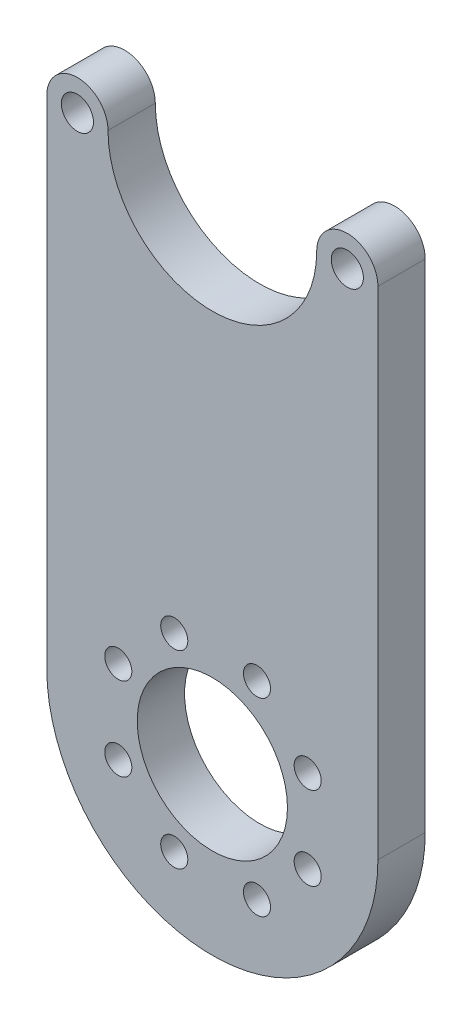
ISO-10303-21;
HEADER;
FILE_DESCRIPTION(('STEP AP214'),'2;1');
FILE_NAME('part.step','',(''),(''),'','','');
FILE_SCHEMA(('AUTOMOTIVE_DESIGN { 1 0 10303 214 1 1 1 1 }'));
ENDSEC;
DATA;
#1=APPLICATION_CONTEXT('core data for automotive mechanical design processes');
#2=APPLICATION_PROTOCOL_DEFINITION('international standard','automotive_design',2000,#1);
#3=PRODUCT_CONTEXT('',#1,'mechanical');
#4=PRODUCT('Part','Part','',(#3));
#5=PRODUCT_RELATED_PRODUCT_CATEGORY('part','',(#4));
#6=PRODUCT_DEFINITION_FORMATION('','',#4);
#7=PRODUCT_DEFINITION_CONTEXT('part definition',#1,'design');
#8=PRODUCT_DEFINITION('design','',#6,#7);
#9=PRODUCT_DEFINITION_SHAPE('','',#8);
#10=(LENGTH_UNIT() NAMED_UNIT(*) SI_UNIT(.MILLI.,.METRE.));
#11=(NAMED_UNIT(*) PLANE_ANGLE_UNIT() SI_UNIT($,.RADIAN.));
#12=(NAMED_UNIT(*) SI_UNIT($,.STERADIAN.) SOLID_ANGLE_UNIT());
#13=UNCERTAINTY_MEASURE_WITH_UNIT(LENGTH_MEASURE(1.E-05),#10,'distance_accuracy_value','');
#14=(GEOMETRIC_REPRESENTATION_CONTEXT(3) GLOBAL_UNCERTAINTY_ASSIGNED_CONTEXT((#13)) GLOBAL_UNIT_ASSIGNED_CONTEXT((#10,
#11,#12)) REPRESENTATION_CONTEXT('',''));
#15=CARTESIAN_POINT('',(0.,0.,0.));
#16=DIRECTION('',(0.,0.,1.));
#17=DIRECTION('',(1.,0.,0.));
#18=AXIS2_PLACEMENT_3D('',#15,#16,#17);
#19=CARTESIAN_POINT('',(-19.6078841858867,35.5737704918033,5.));
#20=DIRECTION('',(0.,0.,-1.));
#21=DIRECTION('',(-1.,0.,0.));
#22=AXIS2_PLACEMENT_3D('',#19,#20,#21);
#23=PLANE('',#22);
#24=CARTESIAN_POINT('',(-19.6078841858867,35.5737704918033,5.));
#25=DIRECTION('',(0.,0.,1.));
#26=DIRECTION('',(-1.,0.,0.));
#27=AXIS2_PLACEMENT_3D('',#24,#25,#26);
#28=CIRCLE('',#27,3.23505242855436);
#29=CARTESIAN_POINT('',(-16.3728317573323,35.5737704918033,5.));
#30=VERTEX_POINT('',#29);
#31=CARTESIAN_POINT('',(-22.842936614441,35.5737704918033,5.));
#32=VERTEX_POINT('',#31);
#33=EDGE_CURVE('E133',#30,#32,#28,.T.);
#34=ORIENTED_EDGE('',*,*,#33,.T.);
#35=DIRECTION('',(0.,-1.,0.));
#36=VECTOR('',#35,1.);
#37=CARTESIAN_POINT('',(-22.842936614441,35.5737704918033,5.));
#38=LINE('',#37,#36);
#39=CARTESIAN_POINT('',(-22.842936614441,-16.9262295081967,5.));
#40=VERTEX_POINT('',#39);
#41=EDGE_CURVE('E91',#32,#40,#38,.T.);
#42=ORIENTED_EDGE('',*,*,#41,.T.);
#43=CARTESIAN_POINT('',(-5.34293661444102,-16.9262295081967,5.));
#44=DIRECTION('',(0.,0.,1.));
#45=DIRECTION('',(1.,0.,0.));
#46=AXIS2_PLACEMENT_3D('',#43,#44,#45);
#47=CIRCLE('',#46,17.5);
#48=CARTESIAN_POINT('',(12.157063385559,-16.9262295081967,5.));
#49=VERTEX_POINT('',#48);
#50=EDGE_CURVE('E104',#40,#49,#47,.T.);
#51=ORIENTED_EDGE('',*,*,#50,.T.);
#52=DIRECTION('',(0.,1.,0.));
#53=VECTOR('',#52,1.);
#54=CARTESIAN_POINT('',(12.157063385559,35.5737704918033,5.));
#55=LINE('',#54,#53);
#56=CARTESIAN_POINT('',(12.157063385559,35.5737704918033,5.));
#57=VERTEX_POINT('',#56);
#58=EDGE_CURVE('E98',#49,#57,#55,.T.);
#59=ORIENTED_EDGE('',*,*,#58,.T.);
#60=CARTESIAN_POINT('',(8.92201095700461,35.5737704918033,5.));
#61=DIRECTION('',(0.,0.,1.));
#62=DIRECTION('',(-1.,0.,0.));
#63=AXIS2_PLACEMENT_3D('',#60,#61,#62);
#64=CIRCLE('',#63,3.23505242855436);
#65=CARTESIAN_POINT('',(5.68695852845025,35.5737704918033,5.));
#66=VERTEX_POINT('',#65);
#67=EDGE_CURVE('E102',#57,#66,#64,.T.);
#68=ORIENTED_EDGE('',*,*,#67,.T.);
#69=CARTESIAN_POINT('',(-5.34293661444103,35.5737704918033,5.));
#70=DIRECTION('',(0.,0.,-1.));
#71=DIRECTION('',(1.,0.,0.));
#72=AXIS2_PLACEMENT_3D('',#69,#70,#71);
#73=CIRCLE('',#72,11.0298951428913);
#74=EDGE_CURVE('E54',#66,#30,#73,.T.);
#75=ORIENTED_EDGE('',*,*,#74,.T.);
#76=EDGE_LOOP('',(#34,#42,#51,#59,#68,#75));
#77=FACE_BOUND('',#76,.T.);
#78=CARTESIAN_POINT('',(-5.34293661444102,-16.9262295081967,5.));
#79=DIRECTION('',(0.,0.,1.));
#80=DIRECTION('',(1.,0.,0.));
#81=AXIS2_PLACEMENT_3D('',#78,#79,#80);
#82=CIRCLE('',#81,7.94);
#83=CARTESIAN_POINT('',(2.59706338555898,-16.9262295081967,5.));
#84=VERTEX_POINT('',#83);
#85=EDGE_CURVE('E126',#84,#84,#82,.T.);
#86=ORIENTED_EDGE('',*,*,#85,.F.);
#87=EDGE_LOOP('',(#86));
#88=FACE_BOUND('',#87,.T.);
#89=CARTESIAN_POINT('',(-19.6078841858867,35.5737704918033,5.));
#90=DIRECTION('',(0.,0.,1.));
#91=DIRECTION('',(1.,0.,0.));
#92=AXIS2_PLACEMENT_3D('',#89,#90,#91);
#93=CIRCLE('',#92,1.69789105682927);
#94=CARTESIAN_POINT('',(-17.9099931290574,35.5737704918033,5.));
#95=VERTEX_POINT('',#94);
#96=EDGE_CURVE('E267',#95,#95,#93,.T.);
#97=ORIENTED_EDGE('',*,*,#96,.F.);
#98=EDGE_LOOP('',(#97));
#99=FACE_BOUND('',#98,.T.);
#100=CARTESIAN_POINT('',(8.92201095700461,35.5737704918033,5.));
#101=DIRECTION('',(0.,0.,1.));
#102=DIRECTION('',(1.,0.,0.));
#103=AXIS2_PLACEMENT_3D('',#100,#101,#102);
#104=CIRCLE('',#103,1.69789105682927);
#105=CARTESIAN_POINT('',(10.6199020138339,35.5737704918033,5.));
#106=VERTEX_POINT('',#105);
#107=EDGE_CURVE('E261',#106,#106,#104,.T.);
#108=ORIENTED_EDGE('',*,*,#107,.F.);
#109=EDGE_LOOP('',(#108));
#110=FACE_BOUND('',#109,.T.);
#111=CARTESIAN_POINT('',(-9.3691056523113,-6.94486730474608,5.));
#112=DIRECTION('',(0.,0.,1.));
#113=DIRECTION('',(1.,0.,0.));
#114=AXIS2_PLACEMENT_3D('',#111,#112,#113);
#115=CIRCLE('',#114,1.4312698132965);
#116=CARTESIAN_POINT('',(-7.93783583901481,-6.94486730474608,5.));
#117=VERTEX_POINT('',#116);
#118=EDGE_CURVE('E255',#117,#117,#115,.T.);
#119=ORIENTED_EDGE('',*,*,#118,.F.);
#120=EDGE_LOOP('',(#119));
#121=FACE_BOUND('',#120,.T.);
#122=CARTESIAN_POINT('',(-15.2861016551569,-12.6984522364104,5.));
#123=DIRECTION('',(0.,0.,1.));
#124=DIRECTION('',(1.,0.,0.));
#125=AXIS2_PLACEMENT_3D('',#122,#123,#124);
#126=CIRCLE('',#125,1.4312698132965);
#127=CARTESIAN_POINT('',(-13.8548318418604,-12.6984522364104,5.));
#128=VERTEX_POINT('',#127);
#129=EDGE_CURVE('E249',#128,#128,#126,.T.);
#130=ORIENTED_EDGE('',*,*,#129,.F.);
#131=EDGE_LOOP('',(#130));
#132=FACE_BOUND('',#131,.T.);
#133=CARTESIAN_POINT('',(-0.625126274009347,-26.9400789936505,5.));
#134=DIRECTION('',(0.,0.,1.));
#135=DIRECTION('',(1.,0.,0.));
#136=AXIS2_PLACEMENT_3D('',#133,#134,#135);
#137=CIRCLE('',#136,1.4312698132965);
#138=CARTESIAN_POINT('',(0.806143539287151,-26.9400789936505,5.));
#139=VERTEX_POINT('',#138);
#140=EDGE_CURVE('E243',#139,#139,#137,.T.);
#141=ORIENTED_EDGE('',*,*,#140,.F.);
#142=EDGE_LOOP('',(#141));
#143=FACE_BOUND('',#142,.T.);
#144=CARTESIAN_POINT('',(-15.2861016551569,-21.4844731955139,5.));
#145=DIRECTION('',(0.,0.,1.));
#146=DIRECTION('',(1.,0.,0.));
#147=AXIS2_PLACEMENT_3D('',#144,#145,#146);
#148=CIRCLE('',#147,1.4312698132965);
#149=CARTESIAN_POINT('',(-13.8548318418604,-21.4844731955139,5.));
#150=VERTEX_POINT('',#149);
#151=EDGE_CURVE('E237',#150,#150,#148,.T.);
#152=ORIENTED_EDGE('',*,*,#151,.F.);
#153=EDGE_LOOP('',(#152));
#154=FACE_BOUND('',#153,.T.);
#155=CARTESIAN_POINT('',(-9.3691056523113,-26.9400789936505,5.));
#156=DIRECTION('',(0.,0.,1.));
#157=DIRECTION('',(1.,0.,0.));
#158=AXIS2_PLACEMENT_3D('',#155,#156,#157);
#159=CIRCLE('',#158,1.4312698132965);
#160=CARTESIAN_POINT('',(-7.93783583901481,-26.9400789936505,5.));
#161=VERTEX_POINT('',#160);
#162=EDGE_CURVE('E231',#161,#161,#159,.T.);
#163=ORIENTED_EDGE('',*,*,#162,.F.);
#164=EDGE_LOOP('',(#163));
#165=FACE_BOUND('',#164,.T.);
#166=CARTESIAN_POINT('',(-0.625126274009347,-6.94486730474608,5.));
#167=DIRECTION('',(0.,0.,1.));
#168=DIRECTION('',(1.,0.,0.));
#169=AXIS2_PLACEMENT_3D('',#166,#167,#168);
#170=CIRCLE('',#169,1.4312698132965);
#171=CARTESIAN_POINT('',(0.806143539287151,-6.94486730474608,5.));
#172=VERTEX_POINT('',#171);
#173=EDGE_CURVE('E225',#172,#172,#170,.T.);
#174=ORIENTED_EDGE('',*,*,#173,.F.);
#175=EDGE_LOOP('',(#174));
#176=FACE_BOUND('',#175,.T.);
#177=CARTESIAN_POINT('',(4.73381383266001,-12.6984522364104,5.));
#178=DIRECTION('',(0.,0.,1.));
#179=DIRECTION('',(1.,0.,0.));
#180=AXIS2_PLACEMENT_3D('',#177,#178,#179);
#181=CIRCLE('',#180,1.4312698132965);
#182=CARTESIAN_POINT('',(6.16508364595651,-12.6984522364104,5.));
#183=VERTEX_POINT('',#182);
#184=EDGE_CURVE('E219',#183,#183,#181,.T.);
#185=ORIENTED_EDGE('',*,*,#184,.F.);
#186=EDGE_LOOP('',(#185));
#187=FACE_BOUND('',#186,.T.);
#188=CARTESIAN_POINT('',(4.73381383266001,-21.4844731955139,5.));
#189=DIRECTION('',(0.,0.,1.));
#190=DIRECTION('',(1.,0.,0.));
#191=AXIS2_PLACEMENT_3D('',#188,#189,#190);
#192=CIRCLE('',#191,1.4312698132965);
#193=CARTESIAN_POINT('',(6.16508364595651,-21.4844731955139,5.));
#194=VERTEX_POINT('',#193);
#195=EDGE_CURVE('E210',#194,#194,#192,.T.);
#196=ORIENTED_EDGE('',*,*,#195,.F.);
#197=EDGE_LOOP('',(#196));
#198=FACE_BOUND('',#197,.T.);
#199=ADVANCED_FACE('F37',(#77,#88,#99,#110,#121,#132,#143,#154,#165,#176,#187,#198),#23,.F.);
#200=CARTESIAN_POINT('',(-19.6078841858867,35.5737704918033,0.));
#201=DIRECTION('',(0.,0.,-1.));
#202=DIRECTION('',(-1.,0.,0.));
#203=AXIS2_PLACEMENT_3D('',#200,#201,#202);
#204=PLANE('',#203);
#205=CARTESIAN_POINT('',(4.73381383266001,-12.6984522364104,0.));
#206=DIRECTION('',(0.,0.,1.));
#207=DIRECTION('',(1.,0.,0.));
#208=AXIS2_PLACEMENT_3D('',#205,#206,#207);
#209=CIRCLE('',#208,1.4312698132965);
#210=CARTESIAN_POINT('',(6.16508364595651,-12.6984522364104,0.));
#211=VERTEX_POINT('',#210);
#212=EDGE_CURVE('E216',#211,#211,#209,.T.);
#213=ORIENTED_EDGE('',*,*,#212,.T.);
#214=EDGE_LOOP('',(#213));
#215=FACE_BOUND('',#214,.T.);
#216=CARTESIAN_POINT('',(-9.3691056523113,-26.9400789936505,0.));
#217=DIRECTION('',(0.,0.,1.));
#218=DIRECTION('',(1.,0.,0.));
#219=AXIS2_PLACEMENT_3D('',#216,#217,#218);
#220=CIRCLE('',#219,1.4312698132965);
#221=CARTESIAN_POINT('',(-7.93783583901481,-26.9400789936505,0.));
#222=VERTEX_POINT('',#221);
#223=EDGE_CURVE('E228',#222,#222,#220,.T.);
#224=ORIENTED_EDGE('',*,*,#223,.T.);
#225=EDGE_LOOP('',(#224));
#226=FACE_BOUND('',#225,.T.);
#227=CARTESIAN_POINT('',(-0.625126274009347,-26.9400789936505,0.));
#228=DIRECTION('',(0.,0.,1.));
#229=DIRECTION('',(1.,0.,0.));
#230=AXIS2_PLACEMENT_3D('',#227,#228,#229);
#231=CIRCLE('',#230,1.4312698132965);
#232=CARTESIAN_POINT('',(0.806143539287151,-26.9400789936505,0.));
#233=VERTEX_POINT('',#232);
#234=EDGE_CURVE('E240',#233,#233,#231,.T.);
#235=ORIENTED_EDGE('',*,*,#234,.T.);
#236=EDGE_LOOP('',(#235));
#237=FACE_BOUND('',#236,.T.);
#238=CARTESIAN_POINT('',(-9.3691056523113,-6.94486730474608,0.));
#239=DIRECTION('',(0.,0.,1.));
#240=DIRECTION('',(1.,0.,0.));
#241=AXIS2_PLACEMENT_3D('',#238,#239,#240);
#242=CIRCLE('',#241,1.4312698132965);
#243=CARTESIAN_POINT('',(-7.93783583901481,-6.94486730474608,0.));
#244=VERTEX_POINT('',#243);
#245=EDGE_CURVE('E252',#244,#244,#242,.T.);
#246=ORIENTED_EDGE('',*,*,#245,.T.);
#247=EDGE_LOOP('',(#246));
#248=FACE_BOUND('',#247,.T.);
#249=CARTESIAN_POINT('',(-19.6078841858867,35.5737704918033,0.));
#250=DIRECTION('',(0.,0.,1.));
#251=DIRECTION('',(1.,0.,0.));
#252=AXIS2_PLACEMENT_3D('',#249,#250,#251);
#253=CIRCLE('',#252,1.69789105682927);
#254=CARTESIAN_POINT('',(-17.9099931290574,35.5737704918033,0.));
#255=VERTEX_POINT('',#254);
#256=EDGE_CURVE('E264',#255,#255,#253,.T.);
#257=ORIENTED_EDGE('',*,*,#256,.T.);
#258=EDGE_LOOP('',(#257));
#259=FACE_BOUND('',#258,.T.);
#260=CARTESIAN_POINT('',(-19.6078841858867,35.5737704918033,0.));
#261=DIRECTION('',(0.,0.,1.));
#262=DIRECTION('',(-1.,0.,0.));
#263=AXIS2_PLACEMENT_3D('',#260,#261,#262);
#264=CIRCLE('',#263,3.23505242855436);
#265=CARTESIAN_POINT('',(-16.3728317573323,35.5737704918033,0.));
#266=VERTEX_POINT('',#265);
#267=CARTESIAN_POINT('',(-22.842936614441,35.5737704918033,0.));
#268=VERTEX_POINT('',#267);
#269=EDGE_CURVE('E122',#266,#268,#264,.T.);
#270=ORIENTED_EDGE('',*,*,#269,.F.);
#271=CARTESIAN_POINT('',(-5.34293661444103,35.5737704918033,0.));
#272=DIRECTION('',(0.,0.,-1.));
#273=DIRECTION('',(1.,0.,0.));
#274=AXIS2_PLACEMENT_3D('',#271,#272,#273);
#275=CIRCLE('',#274,11.0298951428913);
#276=CARTESIAN_POINT('',(5.68695852845025,35.5737704918033,0.));
#277=VERTEX_POINT('',#276);
#278=EDGE_CURVE('E83',#277,#266,#275,.T.);
#279=ORIENTED_EDGE('',*,*,#278,.F.);
#280=CARTESIAN_POINT('',(8.92201095700461,35.5737704918033,0.));
#281=DIRECTION('',(0.,0.,1.));
#282=DIRECTION('',(-1.,0.,0.));
#283=AXIS2_PLACEMENT_3D('',#280,#281,#282);
#284=CIRCLE('',#283,3.23505242855436);
#285=CARTESIAN_POINT('',(12.157063385559,35.5737704918033,0.));
#286=VERTEX_POINT('',#285);
#287=EDGE_CURVE('E77',#286,#277,#284,.T.);
#288=ORIENTED_EDGE('',*,*,#287,.F.);
#289=DIRECTION('',(0.,1.,0.));
#290=VECTOR('',#289,1.);
#291=CARTESIAN_POINT('',(12.157063385559,35.5737704918033,0.));
#292=LINE('',#291,#290);
#293=CARTESIAN_POINT('',(12.157063385559,-16.9262295081967,0.));
#294=VERTEX_POINT('',#293);
#295=EDGE_CURVE('E112',#294,#286,#292,.T.);
#296=ORIENTED_EDGE('',*,*,#295,.F.);
#297=CARTESIAN_POINT('',(-5.34293661444102,-16.9262295081967,0.));
#298=DIRECTION('',(0.,0.,1.));
#299=DIRECTION('',(1.,0.,0.));
#300=AXIS2_PLACEMENT_3D('',#297,#298,#299);
#301=CIRCLE('',#300,17.5);
#302=CARTESIAN_POINT('',(-22.842936614441,-16.9262295081967,0.));
#303=VERTEX_POINT('',#302);
#304=EDGE_CURVE('E128',#303,#294,#301,.T.);
#305=ORIENTED_EDGE('',*,*,#304,.F.);
#306=DIRECTION('',(0.,-1.,0.));
#307=VECTOR('',#306,1.);
#308=CARTESIAN_POINT('',(-22.842936614441,35.5737704918033,0.));
#309=LINE('',#308,#307);
#310=EDGE_CURVE('E125',#268,#303,#309,.T.);
#311=ORIENTED_EDGE('',*,*,#310,.F.);
#312=EDGE_LOOP('',(#270,#279,#288,#296,#305,#311));
#313=FACE_BOUND('',#312,.T.);
#314=CARTESIAN_POINT('',(-5.34293661444102,-16.9262295081967,0.));
#315=DIRECTION('',(0.,0.,1.));
#316=DIRECTION('',(1.,0.,0.));
#317=AXIS2_PLACEMENT_3D('',#314,#315,#316);
#318=CIRCLE('',#317,7.94);
#319=CARTESIAN_POINT('',(2.59706338555898,-16.9262295081967,0.));
#320=VERTEX_POINT('',#319);
#321=EDGE_CURVE('E270',#320,#320,#318,.T.);
#322=ORIENTED_EDGE('',*,*,#321,.T.);
#323=EDGE_LOOP('',(#322));
#324=FACE_BOUND('',#323,.T.);
#325=CARTESIAN_POINT('',(8.92201095700461,35.5737704918033,0.));
#326=DIRECTION('',(0.,0.,1.));
#327=DIRECTION('',(1.,0.,0.));
#328=AXIS2_PLACEMENT_3D('',#325,#326,#327);
#329=CIRCLE('',#328,1.69789105682927);
#330=CARTESIAN_POINT('',(10.6199020138339,35.5737704918033,0.));
#331=VERTEX_POINT('',#330);
#332=EDGE_CURVE('E258',#331,#331,#329,.T.);
#333=ORIENTED_EDGE('',*,*,#332,.T.);
#334=EDGE_LOOP('',(#333));
#335=FACE_BOUND('',#334,.T.);
#336=CARTESIAN_POINT('',(-15.2861016551569,-12.6984522364104,0.));
#337=DIRECTION('',(0.,0.,1.));
#338=DIRECTION('',(1.,0.,0.));
#339=AXIS2_PLACEMENT_3D('',#336,#337,#338);
#340=CIRCLE('',#339,1.4312698132965);
#341=CARTESIAN_POINT('',(-13.8548318418604,-12.6984522364104,0.));
#342=VERTEX_POINT('',#341);
#343=EDGE_CURVE('E246',#342,#342,#340,.T.);
#344=ORIENTED_EDGE('',*,*,#343,.T.);
#345=EDGE_LOOP('',(#344));
#346=FACE_BOUND('',#345,.T.);
#347=CARTESIAN_POINT('',(-15.2861016551569,-21.4844731955139,0.));
#348=DIRECTION('',(0.,0.,1.));
#349=DIRECTION('',(1.,0.,0.));
#350=AXIS2_PLACEMENT_3D('',#347,#348,#349);
#351=CIRCLE('',#350,1.4312698132965);
#352=CARTESIAN_POINT('',(-13.8548318418604,-21.4844731955139,0.));
#353=VERTEX_POINT('',#352);
#354=EDGE_CURVE('E234',#353,#353,#351,.T.);
#355=ORIENTED_EDGE('',*,*,#354,.T.);
#356=EDGE_LOOP('',(#355));
#357=FACE_BOUND('',#356,.T.);
#358=CARTESIAN_POINT('',(-0.625126274009347,-6.94486730474608,0.));
#359=DIRECTION('',(0.,0.,1.));
#360=DIRECTION('',(1.,0.,0.));
#361=AXIS2_PLACEMENT_3D('',#358,#359,#360);
#362=CIRCLE('',#361,1.4312698132965);
#363=CARTESIAN_POINT('',(0.806143539287151,-6.94486730474608,0.));
#364=VERTEX_POINT('',#363);
#365=EDGE_CURVE('E222',#364,#364,#362,.T.);
#366=ORIENTED_EDGE('',*,*,#365,.T.);
#367=EDGE_LOOP('',(#366));
#368=FACE_BOUND('',#367,.T.);
#369=CARTESIAN_POINT('',(4.73381383266001,-21.4844731955139,0.));
#370=DIRECTION('',(0.,0.,1.));
#371=DIRECTION('',(1.,0.,0.));
#372=AXIS2_PLACEMENT_3D('',#369,#370,#371);
#373=CIRCLE('',#372,1.4312698132965);
#374=CARTESIAN_POINT('',(6.16508364595651,-21.4844731955139,0.));
#375=VERTEX_POINT('',#374);
#376=EDGE_CURVE('E213',#375,#375,#373,.T.);
#377=ORIENTED_EDGE('',*,*,#376,.T.);
#378=EDGE_LOOP('',(#377));
#379=FACE_BOUND('',#378,.T.);
#380=ADVANCED_FACE('F142',(#215,#226,#237,#248,#259,#313,#324,#335,#346,#357,#368,#379),#204,.T.);
#381=CARTESIAN_POINT('',(-19.6078841858867,35.5737704918033,5.));
#382=DIRECTION('',(0.,0.,-1.));
#383=DIRECTION('',(-1.,0.,0.));
#384=AXIS2_PLACEMENT_3D('',#381,#382,#383);
#385=CYLINDRICAL_SURFACE('',#384,3.23505242855436);
#386=ORIENTED_EDGE('',*,*,#269,.T.);
#387=DIRECTION('',(0.,0.,-1.));
#388=VECTOR('',#387,1.);
#389=CARTESIAN_POINT('',(-22.842936614441,35.5737704918033,5.));
#390=LINE('',#389,#388);
#391=EDGE_CURVE('E11',#32,#268,#390,.T.);
#392=ORIENTED_EDGE('',*,*,#391,.F.);
#393=ORIENTED_EDGE('',*,*,#33,.F.);
#394=DIRECTION('',(0.,0.,-1.));
#395=VECTOR('',#394,1.);
#396=CARTESIAN_POINT('',(-16.3728317573323,35.5737704918033,5.));
#397=LINE('',#396,#395);
#398=EDGE_CURVE('E118',#30,#266,#397,.T.);
#399=ORIENTED_EDGE('',*,*,#398,.T.);
#400=EDGE_LOOP('',(#386,#392,#393,#399));
#401=FACE_BOUND('',#400,.T.);
#402=ADVANCED_FACE('F39',(#401),#385,.T.);
#403=CARTESIAN_POINT('',(-22.842936614441,35.5737704918033,5.));
#404=DIRECTION('',(1.,0.,0.));
#405=DIRECTION('',(0.,1.,0.));
#406=AXIS2_PLACEMENT_3D('',#403,#404,#405);
#407=PLANE('',#406);
#408=ORIENTED_EDGE('',*,*,#310,.T.);
#409=DIRECTION('',(0.,0.,-1.));
#410=VECTOR('',#409,1.);
#411=CARTESIAN_POINT('',(-22.842936614441,-16.9262295081967,5.));
#412=LINE('',#411,#410);
#413=EDGE_CURVE('E46',#40,#303,#412,.T.);
#414=ORIENTED_EDGE('',*,*,#413,.F.);
#415=ORIENTED_EDGE('',*,*,#41,.F.);
#416=ORIENTED_EDGE('',*,*,#391,.T.);
#417=EDGE_LOOP('',(#408,#414,#415,#416));
#418=FACE_BOUND('',#417,.T.);
#419=ADVANCED_FACE('F397',(#418),#407,.F.);
#420=CARTESIAN_POINT('',(-5.34293661444102,-16.9262295081967,5.));
#421=DIRECTION('',(0.,0.,-1.));
#422=DIRECTION('',(-1.,0.,0.));
#423=AXIS2_PLACEMENT_3D('',#420,#421,#422);
#424=CYLINDRICAL_SURFACE('',#423,17.5);
#425=ORIENTED_EDGE('',*,*,#304,.T.);
#426=DIRECTION('',(0.,0.,-1.));
#427=VECTOR('',#426,1.);
#428=CARTESIAN_POINT('',(12.157063385559,-16.9262295081967,5.));
#429=LINE('',#428,#427);
#430=EDGE_CURVE('E113',#49,#294,#429,.T.);
#431=ORIENTED_EDGE('',*,*,#430,.F.);
#432=ORIENTED_EDGE('',*,*,#50,.F.);
#433=ORIENTED_EDGE('',*,*,#413,.T.);
#434=EDGE_LOOP('',(#425,#431,#432,#433));
#435=FACE_BOUND('',#434,.T.);
#436=ADVANCED_FACE('F139',(#435),#424,.T.);
#437=CARTESIAN_POINT('',(12.157063385559,35.5737704918033,5.));
#438=DIRECTION('',(-1.,0.,0.));
#439=DIRECTION('',(0.,-1.,0.));
#440=AXIS2_PLACEMENT_3D('',#437,#438,#439);
#441=PLANE('',#440);
#442=ORIENTED_EDGE('',*,*,#295,.T.);
#443=DIRECTION('',(0.,0.,-1.));
#444=VECTOR('',#443,1.);
#445=CARTESIAN_POINT('',(12.157063385559,35.5737704918033,5.));
#446=LINE('',#445,#444);
#447=EDGE_CURVE('E109',#57,#286,#446,.T.);
#448=ORIENTED_EDGE('',*,*,#447,.F.);
#449=ORIENTED_EDGE('',*,*,#58,.F.);
#450=ORIENTED_EDGE('',*,*,#430,.T.);
#451=EDGE_LOOP('',(#442,#448,#449,#450));
#452=FACE_BOUND('',#451,.T.);
#453=ADVANCED_FACE('F110',(#452),#441,.F.);
#454=CARTESIAN_POINT('',(8.92201095700461,35.5737704918033,5.));
#455=DIRECTION('',(0.,0.,-1.));
#456=DIRECTION('',(-1.,0.,0.));
#457=AXIS2_PLACEMENT_3D('',#454,#455,#456);
#458=CYLINDRICAL_SURFACE('',#457,3.23505242855436);
#459=ORIENTED_EDGE('',*,*,#287,.T.);
#460=DIRECTION('',(0.,0.,-1.));
#461=VECTOR('',#460,1.);
#462=CARTESIAN_POINT('',(5.68695852845025,35.5737704918033,5.));
#463=LINE('',#462,#461);
#464=EDGE_CURVE('E114',#66,#277,#463,.T.);
#465=ORIENTED_EDGE('',*,*,#464,.F.);
#466=ORIENTED_EDGE('',*,*,#67,.F.);
#467=ORIENTED_EDGE('',*,*,#447,.T.);
#468=EDGE_LOOP('',(#459,#465,#466,#467));
#469=FACE_BOUND('',#468,.T.);
#470=ADVANCED_FACE('F116',(#469),#458,.T.);
#471=CARTESIAN_POINT('',(-5.34293661444103,35.5737704918033,5.));
#472=DIRECTION('',(0.,0.,-1.));
#473=DIRECTION('',(-1.,0.,0.));
#474=AXIS2_PLACEMENT_3D('',#471,#472,#473);
#475=CYLINDRICAL_SURFACE('',#474,11.0298951428913);
#476=ORIENTED_EDGE('',*,*,#278,.T.);
#477=ORIENTED_EDGE('',*,*,#398,.F.);
#478=ORIENTED_EDGE('',*,*,#74,.F.);
#479=ORIENTED_EDGE('',*,*,#464,.T.);
#480=EDGE_LOOP('',(#476,#477,#478,#479));
#481=FACE_BOUND('',#480,.T.);
#482=ADVANCED_FACE('F147',(#481),#475,.F.);
#483=CARTESIAN_POINT('',(-5.34293661444102,-16.9262295081967,5.));
#484=DIRECTION('',(0.,0.,-1.));
#485=DIRECTION('',(-1.,0.,0.));
#486=AXIS2_PLACEMENT_3D('',#483,#484,#485);
#487=CYLINDRICAL_SURFACE('',#486,7.94);
#488=ORIENTED_EDGE('',*,*,#85,.T.);
#489=EDGE_LOOP('',(#488));
#490=FACE_BOUND('',#489,.T.);
#491=ORIENTED_EDGE('',*,*,#321,.F.);
#492=EDGE_LOOP('',(#491));
#493=FACE_BOUND('',#492,.T.);
#494=ADVANCED_FACE('F149',(#490,#493),#487,.F.);
#495=CARTESIAN_POINT('',(-19.6078841858867,35.5737704918033,5.));
#496=DIRECTION('',(0.,0.,-1.));
#497=DIRECTION('',(-1.,0.,0.));
#498=AXIS2_PLACEMENT_3D('',#495,#496,#497);
#499=CYLINDRICAL_SURFACE('',#498,1.69789105682927);
#500=ORIENTED_EDGE('',*,*,#96,.T.);
#501=EDGE_LOOP('',(#500));
#502=FACE_BOUND('',#501,.T.);
#503=ORIENTED_EDGE('',*,*,#256,.F.);
#504=EDGE_LOOP('',(#503));
#505=FACE_BOUND('',#504,.T.);
#506=ADVANCED_FACE('F155',(#502,#505),#499,.F.);
#507=CARTESIAN_POINT('',(8.92201095700461,35.5737704918033,5.));
#508=DIRECTION('',(0.,0.,-1.));
#509=DIRECTION('',(-1.,0.,0.));
#510=AXIS2_PLACEMENT_3D('',#507,#508,#509);
#511=CYLINDRICAL_SURFACE('',#510,1.69789105682927);
#512=ORIENTED_EDGE('',*,*,#107,.T.);
#513=EDGE_LOOP('',(#512));
#514=FACE_BOUND('',#513,.T.);
#515=ORIENTED_EDGE('',*,*,#332,.F.);
#516=EDGE_LOOP('',(#515));
#517=FACE_BOUND('',#516,.T.);
#518=ADVANCED_FACE('F169',(#514,#517),#511,.F.);
#519=CARTESIAN_POINT('',(-9.3691056523113,-6.94486730474608,5.));
#520=DIRECTION('',(0.,0.,-1.));
#521=DIRECTION('',(-1.,0.,0.));
#522=AXIS2_PLACEMENT_3D('',#519,#520,#521);
#523=CYLINDRICAL_SURFACE('',#522,1.4312698132965);
#524=ORIENTED_EDGE('',*,*,#118,.T.);
#525=EDGE_LOOP('',(#524));
#526=FACE_BOUND('',#525,.T.);
#527=ORIENTED_EDGE('',*,*,#245,.F.);
#528=EDGE_LOOP('',(#527));
#529=FACE_BOUND('',#528,.T.);
#530=ADVANCED_FACE('F173',(#526,#529),#523,.F.);
#531=CARTESIAN_POINT('',(-15.2861016551569,-12.6984522364104,5.));
#532=DIRECTION('',(0.,0.,-1.));
#533=DIRECTION('',(-1.,0.,0.));
#534=AXIS2_PLACEMENT_3D('',#531,#532,#533);
#535=CYLINDRICAL_SURFACE('',#534,1.4312698132965);
#536=ORIENTED_EDGE('',*,*,#129,.T.);
#537=EDGE_LOOP('',(#536));
#538=FACE_BOUND('',#537,.T.);
#539=ORIENTED_EDGE('',*,*,#343,.F.);
#540=EDGE_LOOP('',(#539));
#541=FACE_BOUND('',#540,.T.);
#542=ADVANCED_FACE('F177',(#538,#541),#535,.F.);
#543=CARTESIAN_POINT('',(-0.625126274009347,-26.9400789936505,5.));
#544=DIRECTION('',(0.,0.,-1.));
#545=DIRECTION('',(-1.,0.,0.));
#546=AXIS2_PLACEMENT_3D('',#543,#544,#545);
#547=CYLINDRICAL_SURFACE('',#546,1.4312698132965);
#548=ORIENTED_EDGE('',*,*,#140,.T.);
#549=EDGE_LOOP('',(#548));
#550=FACE_BOUND('',#549,.T.);
#551=ORIENTED_EDGE('',*,*,#234,.F.);
#552=EDGE_LOOP('',(#551));
#553=FACE_BOUND('',#552,.T.);
#554=ADVANCED_FACE('F181',(#550,#553),#547,.F.);
#555=CARTESIAN_POINT('',(-15.2861016551569,-21.4844731955139,5.));
#556=DIRECTION('',(0.,0.,-1.));
#557=DIRECTION('',(-1.,0.,0.));
#558=AXIS2_PLACEMENT_3D('',#555,#556,#557);
#559=CYLINDRICAL_SURFACE('',#558,1.4312698132965);
#560=ORIENTED_EDGE('',*,*,#151,.T.);
#561=EDGE_LOOP('',(#560));
#562=FACE_BOUND('',#561,.T.);
#563=ORIENTED_EDGE('',*,*,#354,.F.);
#564=EDGE_LOOP('',(#563));
#565=FACE_BOUND('',#564,.T.);
#566=ADVANCED_FACE('F185',(#562,#565),#559,.F.);
#567=CARTESIAN_POINT('',(-9.3691056523113,-26.9400789936505,5.));
#568=DIRECTION('',(0.,0.,-1.));
#569=DIRECTION('',(-1.,0.,0.));
#570=AXIS2_PLACEMENT_3D('',#567,#568,#569);
#571=CYLINDRICAL_SURFACE('',#570,1.4312698132965);
#572=ORIENTED_EDGE('',*,*,#162,.T.);
#573=EDGE_LOOP('',(#572));
#574=FACE_BOUND('',#573,.T.);
#575=ORIENTED_EDGE('',*,*,#223,.F.);
#576=EDGE_LOOP('',(#575));
#577=FACE_BOUND('',#576,.T.);
#578=ADVANCED_FACE('F189',(#574,#577),#571,.F.);
#579=CARTESIAN_POINT('',(-0.625126274009347,-6.94486730474608,5.));
#580=DIRECTION('',(0.,0.,-1.));
#581=DIRECTION('',(-1.,0.,0.));
#582=AXIS2_PLACEMENT_3D('',#579,#580,#581);
#583=CYLINDRICAL_SURFACE('',#582,1.4312698132965);
#584=ORIENTED_EDGE('',*,*,#173,.T.);
#585=EDGE_LOOP('',(#584));
#586=FACE_BOUND('',#585,.T.);
#587=ORIENTED_EDGE('',*,*,#365,.F.);
#588=EDGE_LOOP('',(#587));
#589=FACE_BOUND('',#588,.T.);
#590=ADVANCED_FACE('F193',(#586,#589),#583,.F.);
#591=CARTESIAN_POINT('',(4.73381383266001,-12.6984522364104,5.));
#592=DIRECTION('',(0.,0.,-1.));
#593=DIRECTION('',(-1.,0.,0.));
#594=AXIS2_PLACEMENT_3D('',#591,#592,#593);
#595=CYLINDRICAL_SURFACE('',#594,1.4312698132965);
#596=ORIENTED_EDGE('',*,*,#184,.T.);
#597=EDGE_LOOP('',(#596));
#598=FACE_BOUND('',#597,.T.);
#599=ORIENTED_EDGE('',*,*,#212,.F.);
#600=EDGE_LOOP('',(#599));
#601=FACE_BOUND('',#600,.T.);
#602=ADVANCED_FACE('F197',(#598,#601),#595,.F.);
#603=CARTESIAN_POINT('',(4.73381383266001,-21.4844731955139,5.));
#604=DIRECTION('',(0.,0.,-1.));
#605=DIRECTION('',(-1.,0.,0.));
#606=AXIS2_PLACEMENT_3D('',#603,#604,#605);
#607=CYLINDRICAL_SURFACE('',#606,1.4312698132965);
#608=ORIENTED_EDGE('',*,*,#195,.T.);
#609=EDGE_LOOP('',(#608));
#610=FACE_BOUND('',#609,.T.);
#611=ORIENTED_EDGE('',*,*,#376,.F.);
#612=EDGE_LOOP('',(#611));
#613=FACE_BOUND('',#612,.T.);
#614=ADVANCED_FACE('F201',(#610,#613),#607,.F.);
#615=CLOSED_SHELL('',(#199,#380,#402,#419,#436,#453,#470,#482,#494,#506,#518,#530,#542,#554,
#566,#578,#590,#602,#614));
#616=MANIFOLD_SOLID_BREP('B2',#615);
#617=ADVANCED_BREP_SHAPE_REPRESENTATION('',(#18,#616),#14);
#618=SHAPE_DEFINITION_REPRESENTATION(#9,#617);
ENDSEC;
END-ISO-10303-21;
